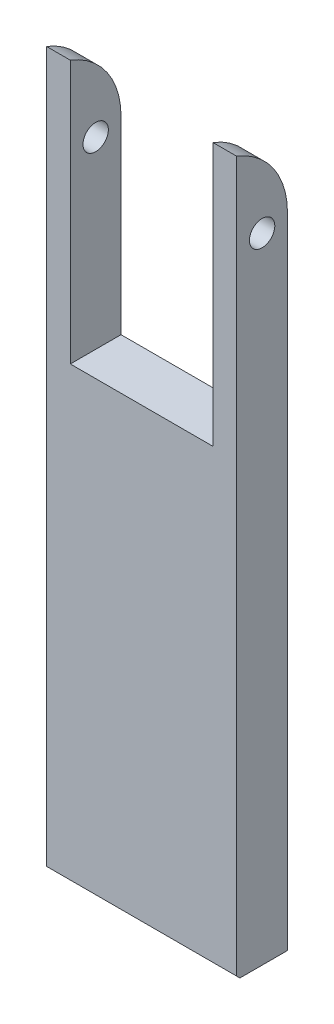
ISO-10303-21;
HEADER;
FILE_DESCRIPTION(('STEP AP214'),'2;1');
FILE_NAME('part.step','',(''),(''),'','','');
FILE_SCHEMA(('AUTOMOTIVE_DESIGN { 1 0 10303 214 1 1 1 1 }'));
ENDSEC;
DATA;
#1=APPLICATION_CONTEXT('core data for automotive mechanical design processes');
#2=APPLICATION_PROTOCOL_DEFINITION('international standard','automotive_design',2000,#1);
#3=PRODUCT_CONTEXT('',#1,'mechanical');
#4=PRODUCT('Part','Part','',(#3));
#5=PRODUCT_RELATED_PRODUCT_CATEGORY('part','',(#4));
#6=PRODUCT_DEFINITION_FORMATION('','',#4);
#7=PRODUCT_DEFINITION_CONTEXT('part definition',#1,'design');
#8=PRODUCT_DEFINITION('design','',#6,#7);
#9=PRODUCT_DEFINITION_SHAPE('','',#8);
#10=(LENGTH_UNIT() NAMED_UNIT(*) SI_UNIT(.MILLI.,.METRE.));
#11=(NAMED_UNIT(*) PLANE_ANGLE_UNIT() SI_UNIT($,.RADIAN.));
#12=(NAMED_UNIT(*) SI_UNIT($,.STERADIAN.) SOLID_ANGLE_UNIT());
#13=UNCERTAINTY_MEASURE_WITH_UNIT(LENGTH_MEASURE(1.E-05),#10,'distance_accuracy_value','');
#14=(GEOMETRIC_REPRESENTATION_CONTEXT(3) GLOBAL_UNCERTAINTY_ASSIGNED_CONTEXT((#13)) GLOBAL_UNIT_ASSIGNED_CONTEXT((#10,
#11,#12)) REPRESENTATION_CONTEXT('',''));
#15=CARTESIAN_POINT('',(0.,0.,0.));
#16=DIRECTION('',(0.,0.,1.));
#17=DIRECTION('',(1.,0.,0.));
#18=AXIS2_PLACEMENT_3D('',#15,#16,#17);
#19=CARTESIAN_POINT('',(0.,0.,16.));
#20=DIRECTION('',(1.,0.,0.));
#21=DIRECTION('',(0.,0.,-1.));
#22=AXIS2_PLACEMENT_3D('',#19,#20,#21);
#23=PLANE('',#22);
#24=CARTESIAN_POINT('',(0.,200.,8.));
#25=DIRECTION('',(-1.,0.,0.));
#26=DIRECTION('',(0.,0.,1.));
#27=AXIS2_PLACEMENT_3D('',#24,#25,#26);
#28=CIRCLE('',#27,4.);
#29=CARTESIAN_POINT('',(0.,200.,12.));
#30=VERTEX_POINT('',#29);
#31=EDGE_CURVE('E141',#30,#30,#28,.T.);
#32=ORIENTED_EDGE('',*,*,#31,.F.);
#33=EDGE_LOOP('',(#32));
#34=FACE_BOUND('',#33,.T.);
#35=DIRECTION('',(0.,-1.,0.));
#36=VECTOR('',#35,1.);
#37=CARTESIAN_POINT('',(0.,0.,16.));
#38=LINE('',#37,#36);
#39=CARTESIAN_POINT('',(0.,225.,16.));
#40=VERTEX_POINT('',#39);
#41=CARTESIAN_POINT('',(0.,1.00000000000006,16.));
#42=VERTEX_POINT('',#41);
#43=EDGE_CURVE('E167',#40,#42,#38,.T.);
#44=ORIENTED_EDGE('',*,*,#43,.F.);
#45=CARTESIAN_POINT('',(0.,201.676192420619,25.));
#46=DIRECTION('',(1.,0.,0.));
#47=DIRECTION('',(0.,0.,-1.));
#48=AXIS2_PLACEMENT_3D('',#45,#46,#47);
#49=CIRCLE('',#48,25.);
#50=CARTESIAN_POINT('',(0.,201.676192420619,0.));
#51=VERTEX_POINT('',#50);
#52=EDGE_CURVE('E46',#40,#51,#49,.F.);
#53=ORIENTED_EDGE('',*,*,#52,.T.);
#54=DIRECTION('',(0.,-1.,0.));
#55=VECTOR('',#54,1.);
#56=CARTESIAN_POINT('',(0.,0.,0.));
#57=LINE('',#56,#55);
#58=CARTESIAN_POINT('',(0.,0.,0.));
#59=VERTEX_POINT('',#58);
#60=EDGE_CURVE('E158',#51,#59,#57,.T.);
#61=ORIENTED_EDGE('',*,*,#60,.T.);
#62=DIRECTION('',(0.,0.,-1.));
#63=VECTOR('',#62,1.);
#64=CARTESIAN_POINT('',(0.,0.,16.));
#65=LINE('',#64,#63);
#66=CARTESIAN_POINT('',(0.,0.,15.));
#67=VERTEX_POINT('',#66);
#68=EDGE_CURVE('E180',#67,#59,#65,.T.);
#69=ORIENTED_EDGE('',*,*,#68,.F.);
#70=DIRECTION('',(0.,-0.707106781186557,-0.707106781186538));
#71=VECTOR('',#70,1.);
#72=CARTESIAN_POINT('',(0.,1.00000000000006,16.));
#73=LINE('',#72,#71);
#74=EDGE_CURVE('E190',#67,#42,#73,.F.);
#75=ORIENTED_EDGE('',*,*,#74,.T.);
#76=EDGE_LOOP('',(#44,#53,#61,#69,#75));
#77=FACE_BOUND('',#76,.T.);
#78=ADVANCED_FACE('F38',(#34,#77),#23,.F.);
#79=CARTESIAN_POINT('',(0.,0.,16.));
#80=DIRECTION('',(0.,1.,0.));
#81=DIRECTION('',(0.,0.,1.));
#82=AXIS2_PLACEMENT_3D('',#79,#80,#81);
#83=PLANE('',#82);
#84=CARTESIAN_POINT('',(41.5,0.,7.49999999999999));
#85=DIRECTION('',(0.,-1.,0.));
#86=DIRECTION('',(0.,0.,-1.));
#87=AXIS2_PLACEMENT_3D('',#84,#85,#86);
#88=CIRCLE('',#87,2.);
#89=CARTESIAN_POINT('',(41.5,0.,5.49999999999998));
#90=VERTEX_POINT('',#89);
#91=EDGE_CURVE('E159',#90,#90,#88,.T.);
#92=ORIENTED_EDGE('',*,*,#91,.F.);
#93=EDGE_LOOP('',(#92));
#94=FACE_BOUND('',#93,.T.);
#95=CARTESIAN_POINT('',(18.5,0.,7.49999999999999));
#96=DIRECTION('',(0.,-1.,0.));
#97=DIRECTION('',(0.,0.,-1.));
#98=AXIS2_PLACEMENT_3D('',#95,#96,#97);
#99=CIRCLE('',#98,2.);
#100=CARTESIAN_POINT('',(18.5,0.,5.49999999999999));
#101=VERTEX_POINT('',#100);
#102=EDGE_CURVE('E162',#101,#101,#99,.T.);
#103=ORIENTED_EDGE('',*,*,#102,.F.);
#104=EDGE_LOOP('',(#103));
#105=FACE_BOUND('',#104,.T.);
#106=DIRECTION('',(0.,0.,-1.));
#107=VECTOR('',#106,1.);
#108=CARTESIAN_POINT('',(60.,0.,16.));
#109=LINE('',#108,#107);
#110=CARTESIAN_POINT('',(60.,0.,15.));
#111=VERTEX_POINT('',#110);
#112=CARTESIAN_POINT('',(60.,0.,0.));
#113=VERTEX_POINT('',#112);
#114=EDGE_CURVE('E172',#111,#113,#109,.T.);
#115=ORIENTED_EDGE('',*,*,#114,.F.);
#116=DIRECTION('',(-1.,0.,0.));
#117=VECTOR('',#116,1.);
#118=CARTESIAN_POINT('',(0.,0.,15.));
#119=LINE('',#118,#117);
#120=EDGE_CURVE('E188',#111,#67,#119,.T.);
#121=ORIENTED_EDGE('',*,*,#120,.T.);
#122=ORIENTED_EDGE('',*,*,#68,.T.);
#123=DIRECTION('',(1.,0.,0.));
#124=VECTOR('',#123,1.);
#125=CARTESIAN_POINT('',(0.,0.,0.));
#126=LINE('',#125,#124);
#127=EDGE_CURVE('E174',#59,#113,#126,.T.);
#128=ORIENTED_EDGE('',*,*,#127,.T.);
#129=EDGE_LOOP('',(#115,#121,#122,#128));
#130=FACE_BOUND('',#129,.T.);
#131=ADVANCED_FACE('F222',(#94,#105,#130),#83,.F.);
#132=CARTESIAN_POINT('',(60.,0.,16.));
#133=DIRECTION('',(-1.,0.,0.));
#134=DIRECTION('',(0.,0.,1.));
#135=AXIS2_PLACEMENT_3D('',#132,#133,#134);
#136=PLANE('',#135);
#137=CARTESIAN_POINT('',(60.,200.,8.));
#138=DIRECTION('',(-1.,0.,0.));
#139=DIRECTION('',(0.,0.,1.));
#140=AXIS2_PLACEMENT_3D('',#137,#138,#139);
#141=CIRCLE('',#140,4.);
#142=CARTESIAN_POINT('',(60.,200.,12.));
#143=VERTEX_POINT('',#142);
#144=EDGE_CURVE('E144',#143,#143,#141,.T.);
#145=ORIENTED_EDGE('',*,*,#144,.T.);
#146=EDGE_LOOP('',(#145));
#147=FACE_BOUND('',#146,.T.);
#148=DIRECTION('',(0.,1.,0.));
#149=VECTOR('',#148,1.);
#150=CARTESIAN_POINT('',(60.,0.,0.));
#151=LINE('',#150,#149);
#152=CARTESIAN_POINT('',(60.,201.676192420619,0.));
#153=VERTEX_POINT('',#152);
#154=EDGE_CURVE('E170',#113,#153,#151,.T.);
#155=ORIENTED_EDGE('',*,*,#154,.T.);
#156=CARTESIAN_POINT('',(60.,201.676192420619,25.));
#157=DIRECTION('',(-1.,0.,0.));
#158=DIRECTION('',(0.,0.,1.));
#159=AXIS2_PLACEMENT_3D('',#156,#157,#158);
#160=CIRCLE('',#159,25.);
#161=CARTESIAN_POINT('',(60.,225.,16.));
#162=VERTEX_POINT('',#161);
#163=EDGE_CURVE('E200',#153,#162,#160,.F.);
#164=ORIENTED_EDGE('',*,*,#163,.T.);
#165=DIRECTION('',(0.,1.,0.));
#166=VECTOR('',#165,1.);
#167=CARTESIAN_POINT('',(60.,0.,16.));
#168=LINE('',#167,#166);
#169=CARTESIAN_POINT('',(60.,1.00000000000006,16.));
#170=VERTEX_POINT('',#169);
#171=EDGE_CURVE('E169',#170,#162,#168,.T.);
#172=ORIENTED_EDGE('',*,*,#171,.F.);
#173=DIRECTION('',(0.,0.707106781186557,0.707106781186538));
#174=VECTOR('',#173,1.);
#175=CARTESIAN_POINT('',(60.,1.00000000000006,16.));
#176=LINE('',#175,#174);
#177=EDGE_CURVE('E186',#170,#111,#176,.F.);
#178=ORIENTED_EDGE('',*,*,#177,.T.);
#179=ORIENTED_EDGE('',*,*,#114,.T.);
#180=EDGE_LOOP('',(#155,#164,#172,#178,#179));
#181=FACE_BOUND('',#180,.T.);
#182=ADVANCED_FACE('F204',(#147,#181),#136,.F.);
#183=CARTESIAN_POINT('',(0.,0.,16.));
#184=DIRECTION('',(0.,0.,-1.));
#185=DIRECTION('',(-1.,0.,0.));
#186=AXIS2_PLACEMENT_3D('',#183,#184,#185);
#187=PLANE('',#186);
#188=DIRECTION('',(0.,-1.,0.));
#189=VECTOR('',#188,1.);
#190=CARTESIAN_POINT('',(52.5,175.,16.));
#191=LINE('',#190,#189);
#192=CARTESIAN_POINT('',(52.5,225.,16.));
#193=VERTEX_POINT('',#192);
#194=CARTESIAN_POINT('',(52.5,142.,16.));
#195=VERTEX_POINT('',#194);
#196=EDGE_CURVE('E108',#193,#195,#191,.T.);
#197=ORIENTED_EDGE('',*,*,#196,.T.);
#198=DIRECTION('',(-1.,0.,0.));
#199=VECTOR('',#198,1.);
#200=CARTESIAN_POINT('',(52.5,142.,16.));
#201=LINE('',#200,#199);
#202=CARTESIAN_POINT('',(7.49999999999996,142.,16.));
#203=VERTEX_POINT('',#202);
#204=EDGE_CURVE('E113',#195,#203,#201,.T.);
#205=ORIENTED_EDGE('',*,*,#204,.T.);
#206=DIRECTION('',(0.,1.,0.));
#207=VECTOR('',#206,1.);
#208=CARTESIAN_POINT('',(7.49999999999998,175.,16.));
#209=LINE('',#208,#207);
#210=CARTESIAN_POINT('',(7.49999999999998,225.,16.));
#211=VERTEX_POINT('',#210);
#212=EDGE_CURVE('E118',#203,#211,#209,.T.);
#213=ORIENTED_EDGE('',*,*,#212,.T.);
#214=DIRECTION('',(-1.,0.,0.));
#215=VECTOR('',#214,1.);
#216=CARTESIAN_POINT('',(60.,225.,16.));
#217=LINE('',#216,#215);
#218=EDGE_CURVE('E138',#211,#40,#217,.T.);
#219=ORIENTED_EDGE('',*,*,#218,.T.);
#220=ORIENTED_EDGE('',*,*,#43,.T.);
#221=DIRECTION('',(1.,0.,0.));
#222=VECTOR('',#221,1.);
#223=CARTESIAN_POINT('',(0.,1.00000000000006,16.));
#224=LINE('',#223,#222);
#225=EDGE_CURVE('E183',#42,#170,#224,.T.);
#226=ORIENTED_EDGE('',*,*,#225,.T.);
#227=ORIENTED_EDGE('',*,*,#171,.T.);
#228=EDGE_CURVE('E116',#162,#193,#217,.T.);
#229=ORIENTED_EDGE('',*,*,#228,.T.);
#230=EDGE_LOOP('',(#197,#205,#213,#219,#220,#226,#227,#229));
#231=FACE_BOUND('',#230,.T.);
#232=ADVANCED_FACE('F110',(#231),#187,.F.);
#233=CARTESIAN_POINT('',(0.,0.,0.));
#234=DIRECTION('',(0.,0.,-1.));
#235=DIRECTION('',(-1.,0.,0.));
#236=AXIS2_PLACEMENT_3D('',#233,#234,#235);
#237=PLANE('',#236);
#238=DIRECTION('',(0.,-1.,0.));
#239=VECTOR('',#238,1.);
#240=CARTESIAN_POINT('',(52.5,175.,0.));
#241=LINE('',#240,#239);
#242=CARTESIAN_POINT('',(52.5,201.676192420619,0.));
#243=VERTEX_POINT('',#242);
#244=CARTESIAN_POINT('',(52.5,142.,0.));
#245=VERTEX_POINT('',#244);
#246=EDGE_CURVE('E125',#243,#245,#241,.T.);
#247=ORIENTED_EDGE('',*,*,#246,.F.);
#248=DIRECTION('',(-1.,0.,0.));
#249=VECTOR('',#248,1.);
#250=CARTESIAN_POINT('',(60.,201.676192420619,0.));
#251=LINE('',#250,#249);
#252=EDGE_CURVE('E198',#243,#153,#251,.F.);
#253=ORIENTED_EDGE('',*,*,#252,.T.);
#254=ORIENTED_EDGE('',*,*,#154,.F.);
#255=ORIENTED_EDGE('',*,*,#127,.F.);
#256=ORIENTED_EDGE('',*,*,#60,.F.);
#257=DIRECTION('',(-1.,0.,0.));
#258=VECTOR('',#257,1.);
#259=CARTESIAN_POINT('',(7.49999999999998,201.676192420619,0.));
#260=LINE('',#259,#258);
#261=CARTESIAN_POINT('',(7.49999999999998,201.676192420619,0.));
#262=VERTEX_POINT('',#261);
#263=EDGE_CURVE('E53',#51,#262,#260,.F.);
#264=ORIENTED_EDGE('',*,*,#263,.T.);
#265=DIRECTION('',(0.,1.,0.));
#266=VECTOR('',#265,1.);
#267=CARTESIAN_POINT('',(7.49999999999998,175.,0.));
#268=LINE('',#267,#266);
#269=CARTESIAN_POINT('',(7.49999999999996,142.,0.));
#270=VERTEX_POINT('',#269);
#271=EDGE_CURVE('E119',#270,#262,#268,.T.);
#272=ORIENTED_EDGE('',*,*,#271,.F.);
#273=DIRECTION('',(-1.,0.,0.));
#274=VECTOR('',#273,1.);
#275=CARTESIAN_POINT('',(52.5,142.,0.));
#276=LINE('',#275,#274);
#277=EDGE_CURVE('E134',#245,#270,#276,.T.);
#278=ORIENTED_EDGE('',*,*,#277,.F.);
#279=EDGE_LOOP('',(#247,#253,#254,#255,#256,#264,#272,#278));
#280=FACE_BOUND('',#279,.T.);
#281=ADVANCED_FACE('F210',(#280),#237,.T.);
#282=CARTESIAN_POINT('',(0.,1.00000000000006,16.));
#283=DIRECTION('',(0.,0.707106781186538,-0.707106781186557));
#284=DIRECTION('',(1.,0.,0.));
#285=AXIS2_PLACEMENT_3D('',#282,#283,#284);
#286=PLANE('',#285);
#287=ORIENTED_EDGE('',*,*,#74,.F.);
#288=ORIENTED_EDGE('',*,*,#120,.F.);
#289=ORIENTED_EDGE('',*,*,#177,.F.);
#290=ORIENTED_EDGE('',*,*,#225,.F.);
#291=EDGE_LOOP('',(#287,#288,#289,#290));
#292=FACE_BOUND('',#291,.T.);
#293=ADVANCED_FACE('F235',(#292),#286,.F.);
#294=CARTESIAN_POINT('',(18.5,15.,7.49999999999999));
#295=DIRECTION('',(0.,-1.,0.));
#296=DIRECTION('',(0.,0.,-1.));
#297=AXIS2_PLACEMENT_3D('',#294,#295,#296);
#298=CYLINDRICAL_SURFACE('',#297,2.);
#299=CARTESIAN_POINT('',(18.5,15.,7.49999999999999));
#300=DIRECTION('',(0.,-1.,0.));
#301=DIRECTION('',(0.,0.,-1.));
#302=AXIS2_PLACEMENT_3D('',#299,#300,#301);
#303=CIRCLE('',#302,2.);
#304=CARTESIAN_POINT('',(18.5,15.,5.49999999999999));
#305=VERTEX_POINT('',#304);
#306=EDGE_CURVE('E152',#305,#305,#303,.T.);
#307=ORIENTED_EDGE('',*,*,#306,.F.);
#308=EDGE_LOOP('',(#307));
#309=FACE_BOUND('',#308,.T.);
#310=ORIENTED_EDGE('',*,*,#102,.T.);
#311=EDGE_LOOP('',(#310));
#312=FACE_BOUND('',#311,.T.);
#313=ADVANCED_FACE('F237',(#309,#312),#298,.F.);
#314=CARTESIAN_POINT('',(18.5,15.,7.49999999999999));
#315=DIRECTION('',(0.,-1.,0.));
#316=DIRECTION('',(0.,0.,-1.));
#317=AXIS2_PLACEMENT_3D('',#314,#315,#316);
#318=PLANE('',#317);
#319=ORIENTED_EDGE('',*,*,#306,.T.);
#320=EDGE_LOOP('',(#319));
#321=FACE_BOUND('',#320,.T.);
#322=ADVANCED_FACE('F243',(#321),#318,.T.);
#323=CARTESIAN_POINT('',(41.5,15.,7.49999999999999));
#324=DIRECTION('',(0.,-1.,0.));
#325=DIRECTION('',(0.,0.,-1.));
#326=AXIS2_PLACEMENT_3D('',#323,#324,#325);
#327=CYLINDRICAL_SURFACE('',#326,2.);
#328=CARTESIAN_POINT('',(41.5,15.,7.49999999999999));
#329=DIRECTION('',(0.,-1.,0.));
#330=DIRECTION('',(0.,0.,-1.));
#331=AXIS2_PLACEMENT_3D('',#328,#329,#330);
#332=CIRCLE('',#331,2.);
#333=CARTESIAN_POINT('',(41.5,15.,5.49999999999998));
#334=VERTEX_POINT('',#333);
#335=EDGE_CURVE('E155',#334,#334,#332,.T.);
#336=ORIENTED_EDGE('',*,*,#335,.F.);
#337=EDGE_LOOP('',(#336));
#338=FACE_BOUND('',#337,.T.);
#339=ORIENTED_EDGE('',*,*,#91,.T.);
#340=EDGE_LOOP('',(#339));
#341=FACE_BOUND('',#340,.T.);
#342=ADVANCED_FACE('F279',(#338,#341),#327,.F.);
#343=CARTESIAN_POINT('',(41.5,15.,7.49999999999999));
#344=DIRECTION('',(0.,-1.,0.));
#345=DIRECTION('',(0.,0.,-1.));
#346=AXIS2_PLACEMENT_3D('',#343,#344,#345);
#347=PLANE('',#346);
#348=ORIENTED_EDGE('',*,*,#335,.T.);
#349=EDGE_LOOP('',(#348));
#350=FACE_BOUND('',#349,.T.);
#351=ADVANCED_FACE('F271',(#350),#347,.T.);
#352=CARTESIAN_POINT('',(52.5,175.,16.));
#353=DIRECTION('',(1.,0.,0.));
#354=DIRECTION('',(0.,0.,-1.));
#355=AXIS2_PLACEMENT_3D('',#352,#353,#354);
#356=PLANE('',#355);
#357=CARTESIAN_POINT('',(52.5,200.,8.));
#358=DIRECTION('',(1.,0.,0.));
#359=DIRECTION('',(0.,0.,-1.));
#360=AXIS2_PLACEMENT_3D('',#357,#358,#359);
#361=CIRCLE('',#360,4.);
#362=CARTESIAN_POINT('',(52.5,200.,12.));
#363=VERTEX_POINT('',#362);
#364=EDGE_CURVE('E148',#363,#363,#361,.T.);
#365=ORIENTED_EDGE('',*,*,#364,.T.);
#366=EDGE_LOOP('',(#365));
#367=FACE_BOUND('',#366,.T.);
#368=ORIENTED_EDGE('',*,*,#196,.F.);
#369=CARTESIAN_POINT('',(52.5,201.676192420619,25.));
#370=DIRECTION('',(1.,0.,0.));
#371=DIRECTION('',(0.,0.,-1.));
#372=AXIS2_PLACEMENT_3D('',#369,#370,#371);
#373=CIRCLE('',#372,25.);
#374=EDGE_CURVE('E193',#193,#243,#373,.F.);
#375=ORIENTED_EDGE('',*,*,#374,.T.);
#376=ORIENTED_EDGE('',*,*,#246,.T.);
#377=DIRECTION('',(0.,0.,-1.));
#378=VECTOR('',#377,1.);
#379=CARTESIAN_POINT('',(52.5,142.,16.));
#380=LINE('',#379,#378);
#381=EDGE_CURVE('E122',#195,#245,#380,.T.);
#382=ORIENTED_EDGE('',*,*,#381,.F.);
#383=EDGE_LOOP('',(#368,#375,#376,#382));
#384=FACE_BOUND('',#383,.T.);
#385=ADVANCED_FACE('F123',(#367,#384),#356,.F.);
#386=CARTESIAN_POINT('',(7.49999999999998,175.,16.));
#387=DIRECTION('',(-1.,0.,0.));
#388=DIRECTION('',(0.,0.,1.));
#389=AXIS2_PLACEMENT_3D('',#386,#387,#388);
#390=PLANE('',#389);
#391=CARTESIAN_POINT('',(7.49999999999998,200.,8.));
#392=DIRECTION('',(-1.,0.,0.));
#393=DIRECTION('',(0.,0.,1.));
#394=AXIS2_PLACEMENT_3D('',#391,#392,#393);
#395=CIRCLE('',#394,4.);
#396=CARTESIAN_POINT('',(7.49999999999999,200.,12.));
#397=VERTEX_POINT('',#396);
#398=EDGE_CURVE('E147',#397,#397,#395,.T.);
#399=ORIENTED_EDGE('',*,*,#398,.T.);
#400=EDGE_LOOP('',(#399));
#401=FACE_BOUND('',#400,.T.);
#402=ORIENTED_EDGE('',*,*,#271,.T.);
#403=CARTESIAN_POINT('',(7.49999999999998,201.676192420619,25.));
#404=DIRECTION('',(-1.,0.,0.));
#405=DIRECTION('',(0.,0.,1.));
#406=AXIS2_PLACEMENT_3D('',#403,#404,#405);
#407=CIRCLE('',#406,25.);
#408=EDGE_CURVE('E12',#262,#211,#407,.F.);
#409=ORIENTED_EDGE('',*,*,#408,.T.);
#410=ORIENTED_EDGE('',*,*,#212,.F.);
#411=DIRECTION('',(0.,0.,-1.));
#412=VECTOR('',#411,1.);
#413=CARTESIAN_POINT('',(7.49999999999996,142.,16.));
#414=LINE('',#413,#412);
#415=EDGE_CURVE('E129',#203,#270,#414,.T.);
#416=ORIENTED_EDGE('',*,*,#415,.T.);
#417=EDGE_LOOP('',(#402,#409,#410,#416));
#418=FACE_BOUND('',#417,.T.);
#419=ADVANCED_FACE('F213',(#401,#418),#390,.F.);
#420=CARTESIAN_POINT('',(60.,200.,8.));
#421=DIRECTION('',(-1.,0.,0.));
#422=DIRECTION('',(0.,0.,1.));
#423=AXIS2_PLACEMENT_3D('',#420,#421,#422);
#424=CYLINDRICAL_SURFACE('',#423,4.);
#425=CARTESIAN_POINT('',(0.,200.,12.));
#426=CARTESIAN_POINT('',(0.0781250000000076,200.,12.));
#427=CARTESIAN_POINT('',(0.156250000000008,200.,12.));
#428=CARTESIAN_POINT('',(0.312500000000007,200.,12.));
#429=CARTESIAN_POINT('',(0.390625000000006,200.,12.));
#430=CARTESIAN_POINT('',(0.546875000000005,200.,12.));
#431=CARTESIAN_POINT('',(0.625000000000005,200.,12.));
#432=CARTESIAN_POINT('',(0.781250000000004,200.,12.));
#433=CARTESIAN_POINT('',(0.859375000000002,200.,12.));
#434=CARTESIAN_POINT('',(1.015625,200.,12.));
#435=CARTESIAN_POINT('',(1.09375,200.,12.));
#436=CARTESIAN_POINT('',(1.25,200.,12.));
#437=CARTESIAN_POINT('',(1.328125,200.,12.));
#438=CARTESIAN_POINT('',(1.484375,200.,12.));
#439=CARTESIAN_POINT('',(1.5625,200.,12.));
#440=CARTESIAN_POINT('',(1.71875,200.,12.));
#441=CARTESIAN_POINT('',(1.796875,200.,12.));
#442=CARTESIAN_POINT('',(1.953125,200.,12.));
#443=CARTESIAN_POINT('',(2.03125,200.,12.));
#444=CARTESIAN_POINT('',(2.1875,200.,12.));
#445=CARTESIAN_POINT('',(2.265625,200.,12.));
#446=CARTESIAN_POINT('',(2.421875,200.,12.));
#447=CARTESIAN_POINT('',(2.5,200.,12.));
#448=CARTESIAN_POINT('',(2.65625,200.,12.));
#449=CARTESIAN_POINT('',(2.734375,200.,12.));
#450=CARTESIAN_POINT('',(2.890625,200.,12.));
#451=CARTESIAN_POINT('',(2.96875,200.,12.));
#452=CARTESIAN_POINT('',(3.125,200.,12.));
#453=CARTESIAN_POINT('',(3.203125,200.,12.));
#454=CARTESIAN_POINT('',(3.359375,200.,12.));
#455=CARTESIAN_POINT('',(3.4375,200.,12.));
#456=CARTESIAN_POINT('',(3.59375,200.,12.));
#457=CARTESIAN_POINT('',(3.671875,200.,12.));
#458=CARTESIAN_POINT('',(3.828125,200.,12.));
#459=CARTESIAN_POINT('',(3.90625,200.,12.));
#460=CARTESIAN_POINT('',(4.0625,200.,12.));
#461=CARTESIAN_POINT('',(4.14062499999999,200.,12.));
#462=CARTESIAN_POINT('',(4.29687499999999,200.,12.));
#463=CARTESIAN_POINT('',(4.37499999999999,200.,12.));
#464=CARTESIAN_POINT('',(4.53124999999999,200.,12.));
#465=CARTESIAN_POINT('',(4.60937499999999,200.,12.));
#466=CARTESIAN_POINT('',(4.76562499999999,200.,12.));
#467=CARTESIAN_POINT('',(4.84374999999999,200.,12.));
#468=CARTESIAN_POINT('',(4.99999999999999,200.,12.));
#469=CARTESIAN_POINT('',(5.07812499999999,200.,12.));
#470=CARTESIAN_POINT('',(5.23437499999999,200.,12.));
#471=CARTESIAN_POINT('',(5.31249999999999,200.,12.));
#472=CARTESIAN_POINT('',(5.46874999999999,200.,12.));
#473=CARTESIAN_POINT('',(5.54687499999999,200.,12.));
#474=CARTESIAN_POINT('',(5.70312499999999,200.,12.));
#475=CARTESIAN_POINT('',(5.78124999999999,200.,12.));
#476=CARTESIAN_POINT('',(5.93749999999999,200.,12.));
#477=CARTESIAN_POINT('',(6.01562499999999,200.,12.));
#478=CARTESIAN_POINT('',(6.17187499999999,200.,12.));
#479=CARTESIAN_POINT('',(6.24999999999999,200.,12.));
#480=CARTESIAN_POINT('',(6.40624999999999,200.,12.));
#481=CARTESIAN_POINT('',(6.48437499999999,200.,12.));
#482=CARTESIAN_POINT('',(6.64062499999999,200.,12.));
#483=CARTESIAN_POINT('',(6.71874999999999,200.,12.));
#484=CARTESIAN_POINT('',(6.87499999999999,200.,12.));
#485=CARTESIAN_POINT('',(6.95312499999999,200.,12.));
#486=CARTESIAN_POINT('',(7.10937499999999,200.,12.));
#487=CARTESIAN_POINT('',(7.18749999999999,200.,12.));
#488=CARTESIAN_POINT('',(7.34374999999998,200.,12.));
#489=CARTESIAN_POINT('',(7.42187499999998,200.,12.));
#490=CARTESIAN_POINT('',(7.49999999999999,200.,12.));
#491=B_SPLINE_CURVE_WITH_KNOTS('',3,(#425,#426,#427,#428,#429,#430,#431,#432,#433,#434,#435,
#436,#437,#438,#439,#440,#441,#442,#443,#444,#445,#446,#447,#448,#449,#450,#451,#452,#453,#454,
#455,#456,#457,#458,#459,#460,#461,#462,#463,#464,#465,#466,#467,#468,#469,#470,#471,#472,#473,
#474,#475,#476,#477,#478,#479,#480,#481,#482,#483,#484,#485,#486,#487,#488,#489,#490),
.UNSPECIFIED.,.F.,.F.,(4,2,2,2,2,2,2,2,2,2,2,2,2,2,2,2,2,2,2,2,2,2,2,2,2,2,2,2,2,2,2,2,4),(0.,
0.234375000000002,0.468749999999997,0.703124999999999,0.937499999999994,1.171875,1.40625,
1.64062499999999,1.87499999999999,2.109375,2.34374999999999,2.57812499999999,2.8125,
3.04687499999999,3.28124999999999,3.51562499999999,3.74999999999999,3.98437499999999,
4.21874999999999,4.45312499999999,4.68749999999998,4.92187499999998,5.15624999999999,
5.39062499999998,5.62499999999998,5.85937499999999,6.09374999999998,6.32812499999998,
6.56249999999998,6.79687499999998,7.03124999999998,7.26562499999998,7.49999999999998),.UNSPECIFIED.);
#492=EDGE_CURVE('BSEAM267',#30,#397,#491,.T.);
#493=ORIENTED_EDGE('',*,*,#31,.T.);
#494=ORIENTED_EDGE('',*,*,#398,.F.);
#495=ORIENTED_EDGE('',*,*,#492,.T.);
#496=ORIENTED_EDGE('',*,*,#492,.F.);
#497=EDGE_LOOP('',(#493,#495,#494,#496));
#498=FACE_BOUND('',#497,.T.);
#499=ADVANCED_FACE('F267',(#498),#424,.F.);
#500=CARTESIAN_POINT('',(60.,200.,12.));
#501=CARTESIAN_POINT('',(59.921875,200.,12.));
#502=CARTESIAN_POINT('',(59.84375,200.,12.));
#503=CARTESIAN_POINT('',(59.6875,200.,12.));
#504=CARTESIAN_POINT('',(59.609375,200.,12.));
#505=CARTESIAN_POINT('',(59.453125,200.,12.));
#506=CARTESIAN_POINT('',(59.375,200.,12.));
#507=CARTESIAN_POINT('',(59.21875,200.,12.));
#508=CARTESIAN_POINT('',(59.140625,200.,12.));
#509=CARTESIAN_POINT('',(58.984375,200.,12.));
#510=CARTESIAN_POINT('',(58.90625,200.,12.));
#511=CARTESIAN_POINT('',(58.75,200.,12.));
#512=CARTESIAN_POINT('',(58.671875,200.,12.));
#513=CARTESIAN_POINT('',(58.515625,200.,12.));
#514=CARTESIAN_POINT('',(58.4375,200.,12.));
#515=CARTESIAN_POINT('',(58.28125,200.,12.));
#516=CARTESIAN_POINT('',(58.203125,200.,12.));
#517=CARTESIAN_POINT('',(58.046875,200.,12.));
#518=CARTESIAN_POINT('',(57.96875,200.,12.));
#519=CARTESIAN_POINT('',(57.8125,200.,12.));
#520=CARTESIAN_POINT('',(57.734375,200.,12.));
#521=CARTESIAN_POINT('',(57.578125,200.,12.));
#522=CARTESIAN_POINT('',(57.5,200.,12.));
#523=CARTESIAN_POINT('',(57.34375,200.,12.));
#524=CARTESIAN_POINT('',(57.265625,200.,12.));
#525=CARTESIAN_POINT('',(57.109375,200.,12.));
#526=CARTESIAN_POINT('',(57.03125,200.,12.));
#527=CARTESIAN_POINT('',(56.875,200.,12.));
#528=CARTESIAN_POINT('',(56.796875,200.,12.));
#529=CARTESIAN_POINT('',(56.640625,200.,12.));
#530=CARTESIAN_POINT('',(56.5625,200.,12.));
#531=CARTESIAN_POINT('',(56.40625,200.,12.));
#532=CARTESIAN_POINT('',(56.328125,200.,12.));
#533=CARTESIAN_POINT('',(56.171875,200.,12.));
#534=CARTESIAN_POINT('',(56.09375,200.,12.));
#535=CARTESIAN_POINT('',(55.9375,200.,12.));
#536=CARTESIAN_POINT('',(55.859375,200.,12.));
#537=CARTESIAN_POINT('',(55.703125,200.,12.));
#538=CARTESIAN_POINT('',(55.625,200.,12.));
#539=CARTESIAN_POINT('',(55.46875,200.,12.));
#540=CARTESIAN_POINT('',(55.390625,200.,12.));
#541=CARTESIAN_POINT('',(55.234375,200.,12.));
#542=CARTESIAN_POINT('',(55.15625,200.,12.));
#543=CARTESIAN_POINT('',(55.,200.,12.));
#544=CARTESIAN_POINT('',(54.921875,200.,12.));
#545=CARTESIAN_POINT('',(54.765625,200.,12.));
#546=CARTESIAN_POINT('',(54.6875,200.,12.));
#547=CARTESIAN_POINT('',(54.53125,200.,12.));
#548=CARTESIAN_POINT('',(54.453125,200.,12.));
#549=CARTESIAN_POINT('',(54.296875,200.,12.));
#550=CARTESIAN_POINT('',(54.21875,200.,12.));
#551=CARTESIAN_POINT('',(54.0625,200.,12.));
#552=CARTESIAN_POINT('',(53.984375,200.,12.));
#553=CARTESIAN_POINT('',(53.828125,200.,12.));
#554=CARTESIAN_POINT('',(53.75,200.,12.));
#555=CARTESIAN_POINT('',(53.59375,200.,12.));
#556=CARTESIAN_POINT('',(53.515625,200.,12.));
#557=CARTESIAN_POINT('',(53.359375,200.,12.));
#558=CARTESIAN_POINT('',(53.28125,200.,12.));
#559=CARTESIAN_POINT('',(53.125,200.,12.));
#560=CARTESIAN_POINT('',(53.046875,200.,12.));
#561=CARTESIAN_POINT('',(52.890625,200.,12.));
#562=CARTESIAN_POINT('',(52.8125,200.,12.));
#563=CARTESIAN_POINT('',(52.65625,200.,12.));
#564=CARTESIAN_POINT('',(52.578125,200.,12.));
#565=CARTESIAN_POINT('',(52.5,200.,12.));
#566=B_SPLINE_CURVE_WITH_KNOTS('',3,(#500,#501,#502,#503,#504,#505,#506,#507,#508,#509,#510,
#511,#512,#513,#514,#515,#516,#517,#518,#519,#520,#521,#522,#523,#524,#525,#526,#527,#528,#529,
#530,#531,#532,#533,#534,#535,#536,#537,#538,#539,#540,#541,#542,#543,#544,#545,#546,#547,#548,
#549,#550,#551,#552,#553,#554,#555,#556,#557,#558,#559,#560,#561,#562,#563,#564,#565),
.UNSPECIFIED.,.F.,.F.,(4,2,2,2,2,2,2,2,2,2,2,2,2,2,2,2,2,2,2,2,2,2,2,2,2,2,2,2,2,2,2,2,4),(0.,
0.234375000000002,0.468750000000004,0.703125000000006,0.937500000000008,1.17187500000001,
1.40625000000001,1.64062500000001,1.87500000000001,2.10937500000001,2.34375000000001,
2.57812500000001,2.81250000000002,3.04687500000002,3.28125000000002,3.51562500000002,
3.75000000000002,3.98437500000002,4.21875000000002,4.45312500000002,4.68750000000002,
4.92187500000003,5.15625000000003,5.39062500000003,5.62500000000003,5.85937500000003,
6.09375000000003,6.32812500000003,6.56250000000003,6.79687500000004,7.03125000000004,
7.26562500000003,7.50000000000003),.UNSPECIFIED.);
#567=EDGE_CURVE('BSEAM264',#143,#363,#566,.T.);
#568=ORIENTED_EDGE('',*,*,#144,.F.);
#569=ORIENTED_EDGE('',*,*,#364,.F.);
#570=ORIENTED_EDGE('',*,*,#567,.T.);
#571=ORIENTED_EDGE('',*,*,#567,.F.);
#572=EDGE_LOOP('',(#568,#570,#569,#571));
#573=FACE_BOUND('',#572,.T.);
#574=ADVANCED_FACE('F264',(#573),#424,.F.);
#575=CARTESIAN_POINT('',(52.5,142.,16.));
#576=DIRECTION('',(0.,-1.,0.));
#577=DIRECTION('',(0.,0.,-1.));
#578=AXIS2_PLACEMENT_3D('',#575,#576,#577);
#579=PLANE('',#578);
#580=ORIENTED_EDGE('',*,*,#277,.T.);
#581=ORIENTED_EDGE('',*,*,#415,.F.);
#582=ORIENTED_EDGE('',*,*,#204,.F.);
#583=ORIENTED_EDGE('',*,*,#381,.T.);
#584=EDGE_LOOP('',(#580,#581,#582,#583));
#585=FACE_BOUND('',#584,.T.);
#586=ADVANCED_FACE('F132',(#585),#579,.F.);
#587=CARTESIAN_POINT('',(60.,201.676192420619,25.));
#588=DIRECTION('',(1.,0.,0.));
#589=DIRECTION('',(0.,0.,-1.));
#590=AXIS2_PLACEMENT_3D('',#587,#588,#589);
#591=CYLINDRICAL_SURFACE('',#590,25.);
#592=ORIENTED_EDGE('',*,*,#163,.F.);
#593=ORIENTED_EDGE('',*,*,#252,.F.);
#594=ORIENTED_EDGE('',*,*,#374,.F.);
#595=ORIENTED_EDGE('',*,*,#228,.F.);
#596=EDGE_LOOP('',(#592,#593,#594,#595));
#597=FACE_BOUND('',#596,.T.);
#598=ADVANCED_FACE('F209',(#597),#591,.T.);
#599=CARTESIAN_POINT('',(60.,201.676192420619,25.));
#600=DIRECTION('',(1.,0.,0.));
#601=DIRECTION('',(0.,0.,-1.));
#602=AXIS2_PLACEMENT_3D('',#599,#600,#601);
#603=CYLINDRICAL_SURFACE('',#602,25.);
#604=ORIENTED_EDGE('',*,*,#408,.F.);
#605=ORIENTED_EDGE('',*,*,#263,.F.);
#606=ORIENTED_EDGE('',*,*,#52,.F.);
#607=ORIENTED_EDGE('',*,*,#218,.F.);
#608=EDGE_LOOP('',(#604,#605,#606,#607));
#609=FACE_BOUND('',#608,.T.);
#610=ADVANCED_FACE('F40',(#609),#603,.T.);
#611=CLOSED_SHELL('',(#78,#131,#182,#232,#281,#293,#313,#322,#342,#351,#385,#419,#499,#574,#586,
#598,#610));
#612=MANIFOLD_SOLID_BREP('B2',#611);
#613=ADVANCED_BREP_SHAPE_REPRESENTATION('',(#18,#612),#14);
#614=SHAPE_DEFINITION_REPRESENTATION(#9,#613);
ENDSEC;
END-ISO-10303-21;
